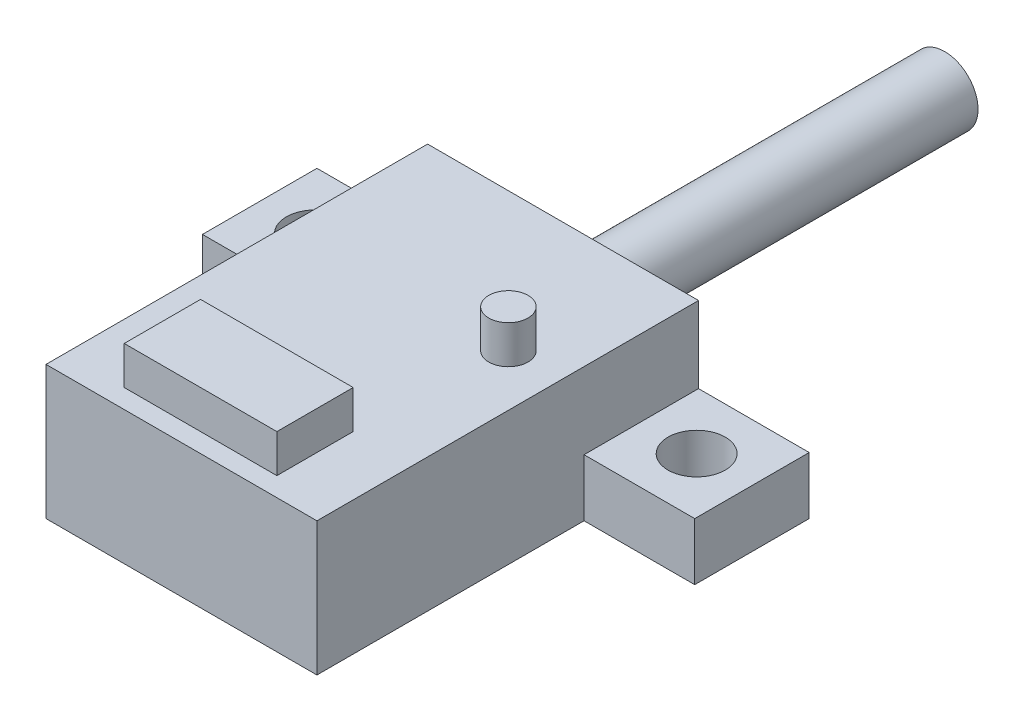
ISO-10303-21;
HEADER;
FILE_DESCRIPTION(('STEP AP214'),'2;1');
FILE_NAME('part.step','',(''),(''),'','','');
FILE_SCHEMA(('AUTOMOTIVE_DESIGN { 1 0 10303 214 1 1 1 1 }'));
ENDSEC;
DATA;
#1=APPLICATION_CONTEXT('core data for automotive mechanical design processes');
#2=APPLICATION_PROTOCOL_DEFINITION('international standard','automotive_design',2000,#1);
#3=PRODUCT_CONTEXT('',#1,'mechanical');
#4=PRODUCT('Part','Part','',(#3));
#5=PRODUCT_RELATED_PRODUCT_CATEGORY('part','',(#4));
#6=PRODUCT_DEFINITION_FORMATION('','',#4);
#7=PRODUCT_DEFINITION_CONTEXT('part definition',#1,'design');
#8=PRODUCT_DEFINITION('design','',#6,#7);
#9=PRODUCT_DEFINITION_SHAPE('','',#8);
#10=(LENGTH_UNIT() NAMED_UNIT(*) SI_UNIT(.MILLI.,.METRE.));
#11=(NAMED_UNIT(*) PLANE_ANGLE_UNIT() SI_UNIT($,.RADIAN.));
#12=(NAMED_UNIT(*) SI_UNIT($,.STERADIAN.) SOLID_ANGLE_UNIT());
#13=UNCERTAINTY_MEASURE_WITH_UNIT(LENGTH_MEASURE(1.E-05),#10,'distance_accuracy_value','');
#14=(GEOMETRIC_REPRESENTATION_CONTEXT(3) GLOBAL_UNCERTAINTY_ASSIGNED_CONTEXT((#13)) GLOBAL_UNIT_ASSIGNED_CONTEXT((#10,
#11,#12)) REPRESENTATION_CONTEXT('',''));
#15=CARTESIAN_POINT('',(0.,0.,0.));
#16=DIRECTION('',(0.,0.,1.));
#17=DIRECTION('',(1.,0.,0.));
#18=AXIS2_PLACEMENT_3D('',#15,#16,#17);
#19=CARTESIAN_POINT('',(0.,7.,0.));
#20=DIRECTION('',(0.,1.,0.));
#21=DIRECTION('',(0.,0.,1.));
#22=AXIS2_PLACEMENT_3D('',#19,#20,#21);
#23=PLANE('',#22);
#24=CARTESIAN_POINT('',(4.39839785551475,7.,-2.73609256270285));
#25=DIRECTION('',(0.,1.,0.));
#26=DIRECTION('',(0.,0.,1.));
#27=AXIS2_PLACEMENT_3D('',#24,#25,#26);
#28=CIRCLE('',#27,1.02876408886078);
#29=CARTESIAN_POINT('',(4.39839785551475,7.,-1.70732847384207));
#30=VERTEX_POINT('',#29);
#31=EDGE_CURVE('E334',#30,#30,#28,.T.);
#32=ORIENTED_EDGE('',*,*,#31,.F.);
#33=EDGE_LOOP('',(#32));
#34=FACE_BOUND('',#33,.T.);
#35=DIRECTION('',(0.,0.,1.));
#36=VECTOR('',#35,1.);
#37=CARTESIAN_POINT('',(7.1,7.,0.));
#38=LINE('',#37,#36);
#39=CARTESIAN_POINT('',(7.1,7.,-10.));
#40=VERTEX_POINT('',#39);
#41=CARTESIAN_POINT('',(7.10000000000001,7.,10.));
#42=VERTEX_POINT('',#41);
#43=EDGE_CURVE('E233',#40,#42,#38,.T.);
#44=ORIENTED_EDGE('',*,*,#43,.F.);
#45=DIRECTION('',(1.,0.,0.));
#46=VECTOR('',#45,1.);
#47=CARTESIAN_POINT('',(0.,7.,-10.));
#48=LINE('',#47,#46);
#49=CARTESIAN_POINT('',(-7.1,7.,-10.));
#50=VERTEX_POINT('',#49);
#51=EDGE_CURVE('E236',#50,#40,#48,.T.);
#52=ORIENTED_EDGE('',*,*,#51,.F.);
#53=DIRECTION('',(0.,0.,1.));
#54=VECTOR('',#53,1.);
#55=CARTESIAN_POINT('',(-7.1,7.,0.));
#56=LINE('',#55,#54);
#57=CARTESIAN_POINT('',(-7.09999999999999,7.,10.));
#58=VERTEX_POINT('',#57);
#59=EDGE_CURVE('E240',#50,#58,#56,.T.);
#60=ORIENTED_EDGE('',*,*,#59,.T.);
#61=DIRECTION('',(1.,0.,0.));
#62=VECTOR('',#61,1.);
#63=CARTESIAN_POINT('',(0.,7.,10.));
#64=LINE('',#63,#62);
#65=EDGE_CURVE('E242',#58,#42,#64,.T.);
#66=ORIENTED_EDGE('',*,*,#65,.T.);
#67=EDGE_LOOP('',(#44,#52,#60,#66));
#68=FACE_BOUND('',#67,.T.);
#69=DIRECTION('',(1.,0.,0.));
#70=VECTOR('',#69,1.);
#71=CARTESIAN_POINT('',(-4.,7.,9.));
#72=LINE('',#71,#70);
#73=CARTESIAN_POINT('',(-4.,7.,9.));
#74=VERTEX_POINT('',#73);
#75=CARTESIAN_POINT('',(4.,7.,9.));
#76=VERTEX_POINT('',#75);
#77=EDGE_CURVE('E346',#74,#76,#72,.T.);
#78=ORIENTED_EDGE('',*,*,#77,.F.);
#79=DIRECTION('',(0.,0.,1.));
#80=VECTOR('',#79,1.);
#81=CARTESIAN_POINT('',(-4.,7.,5.00000000000001));
#82=LINE('',#81,#80);
#83=CARTESIAN_POINT('',(-4.,7.,5.00000000000001));
#84=VERTEX_POINT('',#83);
#85=EDGE_CURVE('E166',#84,#74,#82,.T.);
#86=ORIENTED_EDGE('',*,*,#85,.F.);
#87=DIRECTION('',(-1.,0.,0.));
#88=VECTOR('',#87,1.);
#89=CARTESIAN_POINT('',(-4.,7.,5.00000000000001));
#90=LINE('',#89,#88);
#91=CARTESIAN_POINT('',(4.,7.,5.));
#92=VERTEX_POINT('',#91);
#93=EDGE_CURVE('E162',#92,#84,#90,.T.);
#94=ORIENTED_EDGE('',*,*,#93,.F.);
#95=DIRECTION('',(0.,0.,-1.));
#96=VECTOR('',#95,1.);
#97=CARTESIAN_POINT('',(4.,7.,5.));
#98=LINE('',#97,#96);
#99=EDGE_CURVE('E348',#76,#92,#98,.T.);
#100=ORIENTED_EDGE('',*,*,#99,.F.);
#101=EDGE_LOOP('',(#78,#86,#94,#100));
#102=FACE_BOUND('',#101,.T.);
#103=ADVANCED_FACE('F43',(#34,#68,#102),#23,.T.);
#104=CARTESIAN_POINT('',(7.1,7.,0.));
#105=DIRECTION('',(1.,0.,0.));
#106=DIRECTION('',(0.,0.,-1.));
#107=AXIS2_PLACEMENT_3D('',#104,#105,#106);
#108=PLANE('',#107);
#109=DIRECTION('',(0.,-1.,0.));
#110=VECTOR('',#109,1.);
#111=CARTESIAN_POINT('',(7.1,3.,-4.));
#112=LINE('',#111,#110);
#113=CARTESIAN_POINT('',(7.1,3.,-4.));
#114=VERTEX_POINT('',#113);
#115=CARTESIAN_POINT('',(7.1,0.,-4.));
#116=VERTEX_POINT('',#115);
#117=EDGE_CURVE('E198',#114,#116,#112,.T.);
#118=ORIENTED_EDGE('',*,*,#117,.F.);
#119=DIRECTION('',(0.,0.,1.));
#120=VECTOR('',#119,1.);
#121=CARTESIAN_POINT('',(7.1,3.,0.));
#122=LINE('',#121,#120);
#123=CARTESIAN_POINT('',(7.1,3.,-10.));
#124=VERTEX_POINT('',#123);
#125=EDGE_CURVE('E66',#124,#114,#122,.T.);
#126=ORIENTED_EDGE('',*,*,#125,.F.);
#127=DIRECTION('',(0.,-1.,0.));
#128=VECTOR('',#127,1.);
#129=CARTESIAN_POINT('',(7.1,7.,-10.));
#130=LINE('',#129,#128);
#131=EDGE_CURVE('E11',#40,#124,#130,.T.);
#132=ORIENTED_EDGE('',*,*,#131,.F.);
#133=ORIENTED_EDGE('',*,*,#43,.T.);
#134=DIRECTION('',(0.,-1.,0.));
#135=VECTOR('',#134,1.);
#136=CARTESIAN_POINT('',(7.10000000000001,7.,10.));
#137=LINE('',#136,#135);
#138=CARTESIAN_POINT('',(7.10000000000001,0.,10.));
#139=VERTEX_POINT('',#138);
#140=EDGE_CURVE('E244',#42,#139,#137,.T.);
#141=ORIENTED_EDGE('',*,*,#140,.T.);
#142=DIRECTION('',(0.,0.,1.));
#143=VECTOR('',#142,1.);
#144=CARTESIAN_POINT('',(7.1,0.,0.));
#145=LINE('',#144,#143);
#146=EDGE_CURVE('E232',#116,#139,#145,.T.);
#147=ORIENTED_EDGE('',*,*,#146,.F.);
#148=EDGE_LOOP('',(#118,#126,#132,#133,#141,#147));
#149=FACE_BOUND('',#148,.T.);
#150=ADVANCED_FACE('F45',(#149),#108,.T.);
#151=CARTESIAN_POINT('',(0.,7.,-10.));
#152=DIRECTION('',(0.,0.,-1.));
#153=DIRECTION('',(-1.,0.,0.));
#154=AXIS2_PLACEMENT_3D('',#151,#152,#153);
#155=PLANE('',#154);
#156=CARTESIAN_POINT('',(0.,2.99999999999295,-10.));
#157=DIRECTION('',(0.,0.,-1.));
#158=DIRECTION('',(-1.,0.,0.));
#159=AXIS2_PLACEMENT_3D('',#156,#157,#158);
#160=CIRCLE('',#159,1.75);
#161=CARTESIAN_POINT('',(-1.75,2.99999999999295,-10.));
#162=VERTEX_POINT('',#161);
#163=EDGE_CURVE('E329',#162,#162,#160,.T.);
#164=ORIENTED_EDGE('',*,*,#163,.F.);
#165=EDGE_LOOP('',(#164));
#166=FACE_BOUND('',#165,.T.);
#167=DIRECTION('',(1.,0.,0.));
#168=VECTOR('',#167,1.);
#169=CARTESIAN_POINT('',(0.,0.,-10.));
#170=LINE('',#169,#168);
#171=CARTESIAN_POINT('',(-12.9,0.,-10.));
#172=VERTEX_POINT('',#171);
#173=CARTESIAN_POINT('',(12.9,0.,-10.));
#174=VERTEX_POINT('',#173);
#175=EDGE_CURVE('E246',#172,#174,#170,.T.);
#176=ORIENTED_EDGE('',*,*,#175,.F.);
#177=DIRECTION('',(0.,-1.,0.));
#178=VECTOR('',#177,1.);
#179=CARTESIAN_POINT('',(-12.9,3.,-10.));
#180=LINE('',#179,#178);
#181=CARTESIAN_POINT('',(-12.9,3.,-10.));
#182=VERTEX_POINT('',#181);
#183=EDGE_CURVE('E229',#182,#172,#180,.T.);
#184=ORIENTED_EDGE('',*,*,#183,.F.);
#185=DIRECTION('',(-1.,0.,0.));
#186=VECTOR('',#185,1.);
#187=CARTESIAN_POINT('',(0.,3.,-10.));
#188=LINE('',#187,#186);
#189=CARTESIAN_POINT('',(-7.1,3.,-10.));
#190=VERTEX_POINT('',#189);
#191=EDGE_CURVE('E205',#190,#182,#188,.T.);
#192=ORIENTED_EDGE('',*,*,#191,.F.);
#193=DIRECTION('',(0.,-1.,0.));
#194=VECTOR('',#193,1.);
#195=CARTESIAN_POINT('',(-7.1,7.,-10.));
#196=LINE('',#195,#194);
#197=EDGE_CURVE('E51',#50,#190,#196,.T.);
#198=ORIENTED_EDGE('',*,*,#197,.F.);
#199=ORIENTED_EDGE('',*,*,#51,.T.);
#200=ORIENTED_EDGE('',*,*,#131,.T.);
#201=DIRECTION('',(1.,0.,0.));
#202=VECTOR('',#201,1.);
#203=CARTESIAN_POINT('',(0.,3.,-9.99999999999999));
#204=LINE('',#203,#202);
#205=CARTESIAN_POINT('',(12.9,3.,-10.));
#206=VERTEX_POINT('',#205);
#207=EDGE_CURVE('E176',#124,#206,#204,.T.);
#208=ORIENTED_EDGE('',*,*,#207,.T.);
#209=DIRECTION('',(0.,-1.,0.));
#210=VECTOR('',#209,1.);
#211=CARTESIAN_POINT('',(12.9,3.,-10.));
#212=LINE('',#211,#210);
#213=EDGE_CURVE('E188',#206,#174,#212,.T.);
#214=ORIENTED_EDGE('',*,*,#213,.T.);
#215=EDGE_LOOP('',(#176,#184,#192,#198,#199,#200,#208,#214));
#216=FACE_BOUND('',#215,.T.);
#217=ADVANCED_FACE('F264',(#166,#216),#155,.T.);
#218=CARTESIAN_POINT('',(-7.1,7.,0.));
#219=DIRECTION('',(1.,0.,0.));
#220=DIRECTION('',(0.,0.,-1.));
#221=AXIS2_PLACEMENT_3D('',#218,#219,#220);
#222=PLANE('',#221);
#223=ORIENTED_EDGE('',*,*,#197,.T.);
#224=DIRECTION('',(0.,0.,1.));
#225=VECTOR('',#224,1.);
#226=CARTESIAN_POINT('',(-7.1,3.,0.));
#227=LINE('',#226,#225);
#228=CARTESIAN_POINT('',(-7.1,3.,-4.));
#229=VERTEX_POINT('',#228);
#230=EDGE_CURVE('E214',#190,#229,#227,.T.);
#231=ORIENTED_EDGE('',*,*,#230,.T.);
#232=DIRECTION('',(0.,-1.,0.));
#233=VECTOR('',#232,1.);
#234=CARTESIAN_POINT('',(-7.1,3.,-4.));
#235=LINE('',#234,#233);
#236=CARTESIAN_POINT('',(-7.1,0.,-4.));
#237=VERTEX_POINT('',#236);
#238=EDGE_CURVE('E217',#229,#237,#235,.T.);
#239=ORIENTED_EDGE('',*,*,#238,.T.);
#240=DIRECTION('',(0.,0.,1.));
#241=VECTOR('',#240,1.);
#242=CARTESIAN_POINT('',(-7.1,0.,0.));
#243=LINE('',#242,#241);
#244=CARTESIAN_POINT('',(-7.09999999999999,0.,10.));
#245=VERTEX_POINT('',#244);
#246=EDGE_CURVE('E248',#237,#245,#243,.T.);
#247=ORIENTED_EDGE('',*,*,#246,.T.);
#248=DIRECTION('',(0.,-1.,0.));
#249=VECTOR('',#248,1.);
#250=CARTESIAN_POINT('',(-7.09999999999999,7.,10.));
#251=LINE('',#250,#249);
#252=EDGE_CURVE('E254',#58,#245,#251,.T.);
#253=ORIENTED_EDGE('',*,*,#252,.F.);
#254=ORIENTED_EDGE('',*,*,#59,.F.);
#255=EDGE_LOOP('',(#223,#231,#239,#247,#253,#254));
#256=FACE_BOUND('',#255,.T.);
#257=ADVANCED_FACE('F259',(#256),#222,.F.);
#258=CARTESIAN_POINT('',(0.,7.,10.));
#259=DIRECTION('',(0.,0.,-1.));
#260=DIRECTION('',(-1.,0.,0.));
#261=AXIS2_PLACEMENT_3D('',#258,#259,#260);
#262=PLANE('',#261);
#263=DIRECTION('',(1.,0.,0.));
#264=VECTOR('',#263,1.);
#265=CARTESIAN_POINT('',(0.,0.,10.));
#266=LINE('',#265,#264);
#267=EDGE_CURVE('E237',#245,#139,#266,.T.);
#268=ORIENTED_EDGE('',*,*,#267,.T.);
#269=ORIENTED_EDGE('',*,*,#140,.F.);
#270=ORIENTED_EDGE('',*,*,#65,.F.);
#271=ORIENTED_EDGE('',*,*,#252,.T.);
#272=EDGE_LOOP('',(#268,#269,#270,#271));
#273=FACE_BOUND('',#272,.T.);
#274=ADVANCED_FACE('F281',(#273),#262,.F.);
#275=CARTESIAN_POINT('',(0.,0.,0.));
#276=DIRECTION('',(0.,1.,0.));
#277=DIRECTION('',(0.,0.,1.));
#278=AXIS2_PLACEMENT_3D('',#275,#276,#277);
#279=PLANE('',#278);
#280=ORIENTED_EDGE('',*,*,#175,.T.);
#281=DIRECTION('',(0.,0.,1.));
#282=VECTOR('',#281,1.);
#283=CARTESIAN_POINT('',(12.9,0.,0.));
#284=LINE('',#283,#282);
#285=CARTESIAN_POINT('',(12.9,0.,-4.));
#286=VERTEX_POINT('',#285);
#287=EDGE_CURVE('E171',#174,#286,#284,.T.);
#288=ORIENTED_EDGE('',*,*,#287,.T.);
#289=DIRECTION('',(1.,0.,0.));
#290=VECTOR('',#289,1.);
#291=CARTESIAN_POINT('',(0.,0.,-4.));
#292=LINE('',#291,#290);
#293=EDGE_CURVE('E168',#116,#286,#292,.T.);
#294=ORIENTED_EDGE('',*,*,#293,.F.);
#295=ORIENTED_EDGE('',*,*,#146,.T.);
#296=ORIENTED_EDGE('',*,*,#267,.F.);
#297=ORIENTED_EDGE('',*,*,#246,.F.);
#298=DIRECTION('',(-1.,0.,0.));
#299=VECTOR('',#298,1.);
#300=CARTESIAN_POINT('',(0.,0.,-4.));
#301=LINE('',#300,#299);
#302=CARTESIAN_POINT('',(-12.9,0.,-4.));
#303=VERTEX_POINT('',#302);
#304=EDGE_CURVE('E206',#237,#303,#301,.T.);
#305=ORIENTED_EDGE('',*,*,#304,.T.);
#306=DIRECTION('',(0.,0.,1.));
#307=VECTOR('',#306,1.);
#308=CARTESIAN_POINT('',(-12.9,0.,0.));
#309=LINE('',#308,#307);
#310=EDGE_CURVE('E220',#172,#303,#309,.T.);
#311=ORIENTED_EDGE('',*,*,#310,.F.);
#312=EDGE_LOOP('',(#280,#288,#294,#295,#296,#297,#305,#311));
#313=FACE_BOUND('',#312,.T.);
#314=CARTESIAN_POINT('',(-10.,0.,-7.));
#315=DIRECTION('',(0.,1.,0.));
#316=DIRECTION('',(0.,0.,1.));
#317=AXIS2_PLACEMENT_3D('',#314,#315,#316);
#318=CIRCLE('',#317,1.5);
#319=CARTESIAN_POINT('',(-10.,0.,-5.5));
#320=VERTEX_POINT('',#319);
#321=EDGE_CURVE('E201',#320,#320,#318,.T.);
#322=ORIENTED_EDGE('',*,*,#321,.T.);
#323=EDGE_LOOP('',(#322));
#324=FACE_BOUND('',#323,.T.);
#325=CARTESIAN_POINT('',(10.,0.,-7.));
#326=DIRECTION('',(0.,1.,0.));
#327=DIRECTION('',(0.,0.,1.));
#328=AXIS2_PLACEMENT_3D('',#325,#326,#327);
#329=CIRCLE('',#328,1.5);
#330=CARTESIAN_POINT('',(10.,0.,-5.50000000000001));
#331=VERTEX_POINT('',#330);
#332=EDGE_CURVE('E179',#331,#331,#329,.F.);
#333=ORIENTED_EDGE('',*,*,#332,.F.);
#334=EDGE_LOOP('',(#333));
#335=FACE_BOUND('',#334,.T.);
#336=ADVANCED_FACE('F275',(#313,#324,#335),#279,.F.);
#337=CARTESIAN_POINT('',(-12.9,3.,0.));
#338=DIRECTION('',(1.,0.,0.));
#339=DIRECTION('',(0.,0.,-1.));
#340=AXIS2_PLACEMENT_3D('',#337,#338,#339);
#341=PLANE('',#340);
#342=ORIENTED_EDGE('',*,*,#310,.T.);
#343=DIRECTION('',(0.,-1.,0.));
#344=VECTOR('',#343,1.);
#345=CARTESIAN_POINT('',(-12.9,3.,-4.));
#346=LINE('',#345,#344);
#347=CARTESIAN_POINT('',(-12.9,3.,-4.));
#348=VERTEX_POINT('',#347);
#349=EDGE_CURVE('E227',#348,#303,#346,.T.);
#350=ORIENTED_EDGE('',*,*,#349,.F.);
#351=DIRECTION('',(0.,0.,1.));
#352=VECTOR('',#351,1.);
#353=CARTESIAN_POINT('',(-12.9,3.,0.));
#354=LINE('',#353,#352);
#355=EDGE_CURVE('E209',#182,#348,#354,.T.);
#356=ORIENTED_EDGE('',*,*,#355,.F.);
#357=ORIENTED_EDGE('',*,*,#183,.T.);
#358=EDGE_LOOP('',(#342,#350,#356,#357));
#359=FACE_BOUND('',#358,.T.);
#360=ADVANCED_FACE('F297',(#359),#341,.F.);
#361=CARTESIAN_POINT('',(0.,3.,-4.));
#362=DIRECTION('',(0.,0.,1.));
#363=DIRECTION('',(1.,0.,0.));
#364=AXIS2_PLACEMENT_3D('',#361,#362,#363);
#365=PLANE('',#364);
#366=ORIENTED_EDGE('',*,*,#304,.F.);
#367=ORIENTED_EDGE('',*,*,#238,.F.);
#368=DIRECTION('',(-1.,0.,0.));
#369=VECTOR('',#368,1.);
#370=CARTESIAN_POINT('',(0.,3.,-4.));
#371=LINE('',#370,#369);
#372=EDGE_CURVE('E211',#229,#348,#371,.T.);
#373=ORIENTED_EDGE('',*,*,#372,.T.);
#374=ORIENTED_EDGE('',*,*,#349,.T.);
#375=EDGE_LOOP('',(#366,#367,#373,#374));
#376=FACE_BOUND('',#375,.T.);
#377=ADVANCED_FACE('F271',(#376),#365,.T.);
#378=CARTESIAN_POINT('',(-10.,3.,-7.));
#379=DIRECTION('',(0.,-1.,0.));
#380=DIRECTION('',(0.,0.,-1.));
#381=AXIS2_PLACEMENT_3D('',#378,#379,#380);
#382=CYLINDRICAL_SURFACE('',#381,1.5);
#383=CARTESIAN_POINT('',(-10.,3.,-7.));
#384=DIRECTION('',(0.,1.,0.));
#385=DIRECTION('',(0.,0.,1.));
#386=AXIS2_PLACEMENT_3D('',#383,#384,#385);
#387=CIRCLE('',#386,1.5);
#388=CARTESIAN_POINT('',(-10.,3.,-5.5));
#389=VERTEX_POINT('',#388);
#390=EDGE_CURVE('E202',#389,#389,#387,.T.);
#391=ORIENTED_EDGE('',*,*,#390,.T.);
#392=EDGE_LOOP('',(#391));
#393=FACE_BOUND('',#392,.T.);
#394=ORIENTED_EDGE('',*,*,#321,.F.);
#395=EDGE_LOOP('',(#394));
#396=FACE_BOUND('',#395,.T.);
#397=ADVANCED_FACE('F304',(#393,#396),#382,.F.);
#398=CARTESIAN_POINT('',(0.,3.,0.));
#399=DIRECTION('',(0.,1.,0.));
#400=DIRECTION('',(0.,0.,1.));
#401=AXIS2_PLACEMENT_3D('',#398,#399,#400);
#402=PLANE('',#401);
#403=ORIENTED_EDGE('',*,*,#390,.F.);
#404=EDGE_LOOP('',(#403));
#405=FACE_BOUND('',#404,.T.);
#406=ORIENTED_EDGE('',*,*,#191,.T.);
#407=ORIENTED_EDGE('',*,*,#355,.T.);
#408=ORIENTED_EDGE('',*,*,#372,.F.);
#409=ORIENTED_EDGE('',*,*,#230,.F.);
#410=EDGE_LOOP('',(#406,#407,#408,#409));
#411=FACE_BOUND('',#410,.T.);
#412=ADVANCED_FACE('F268',(#405,#411),#402,.T.);
#413=CARTESIAN_POINT('',(0.,3.,-4.));
#414=DIRECTION('',(0.,0.,-1.));
#415=DIRECTION('',(-1.,0.,0.));
#416=AXIS2_PLACEMENT_3D('',#413,#414,#415);
#417=PLANE('',#416);
#418=ORIENTED_EDGE('',*,*,#293,.T.);
#419=DIRECTION('',(0.,-1.,0.));
#420=VECTOR('',#419,1.);
#421=CARTESIAN_POINT('',(12.9,3.,-4.));
#422=LINE('',#421,#420);
#423=CARTESIAN_POINT('',(12.9,3.,-4.));
#424=VERTEX_POINT('',#423);
#425=EDGE_CURVE('E196',#424,#286,#422,.T.);
#426=ORIENTED_EDGE('',*,*,#425,.F.);
#427=DIRECTION('',(1.,0.,0.));
#428=VECTOR('',#427,1.);
#429=CARTESIAN_POINT('',(0.,3.,-4.));
#430=LINE('',#429,#428);
#431=EDGE_CURVE('E181',#114,#424,#430,.T.);
#432=ORIENTED_EDGE('',*,*,#431,.F.);
#433=ORIENTED_EDGE('',*,*,#117,.T.);
#434=EDGE_LOOP('',(#418,#426,#432,#433));
#435=FACE_BOUND('',#434,.T.);
#436=ADVANCED_FACE('F378',(#435),#417,.F.);
#437=CARTESIAN_POINT('',(12.9,3.,0.));
#438=DIRECTION('',(1.,0.,0.));
#439=DIRECTION('',(0.,0.,-1.));
#440=AXIS2_PLACEMENT_3D('',#437,#438,#439);
#441=PLANE('',#440);
#442=ORIENTED_EDGE('',*,*,#287,.F.);
#443=ORIENTED_EDGE('',*,*,#213,.F.);
#444=DIRECTION('',(0.,0.,1.));
#445=VECTOR('',#444,1.);
#446=CARTESIAN_POINT('',(12.9,3.,0.));
#447=LINE('',#446,#445);
#448=EDGE_CURVE('E183',#206,#424,#447,.T.);
#449=ORIENTED_EDGE('',*,*,#448,.T.);
#450=ORIENTED_EDGE('',*,*,#425,.T.);
#451=EDGE_LOOP('',(#442,#443,#449,#450));
#452=FACE_BOUND('',#451,.T.);
#453=ADVANCED_FACE('F295',(#452),#441,.T.);
#454=CARTESIAN_POINT('',(10.,3.,-7.));
#455=DIRECTION('',(0.,-1.,0.));
#456=DIRECTION('',(0.,0.,-1.));
#457=AXIS2_PLACEMENT_3D('',#454,#455,#456);
#458=CYLINDRICAL_SURFACE('',#457,1.5);
#459=CARTESIAN_POINT('',(10.,3.,-7.));
#460=DIRECTION('',(0.,1.,0.));
#461=DIRECTION('',(0.,0.,1.));
#462=AXIS2_PLACEMENT_3D('',#459,#460,#461);
#463=CIRCLE('',#462,1.5);
#464=CARTESIAN_POINT('',(10.,3.,-5.50000000000001));
#465=VERTEX_POINT('',#464);
#466=EDGE_CURVE('E186',#465,#465,#463,.F.);
#467=ORIENTED_EDGE('',*,*,#466,.F.);
#468=EDGE_LOOP('',(#467));
#469=FACE_BOUND('',#468,.T.);
#470=ORIENTED_EDGE('',*,*,#332,.T.);
#471=EDGE_LOOP('',(#470));
#472=FACE_BOUND('',#471,.T.);
#473=ADVANCED_FACE('F372',(#469,#472),#458,.F.);
#474=CARTESIAN_POINT('',(0.,3.,0.));
#475=DIRECTION('',(0.,1.,0.));
#476=DIRECTION('',(0.,0.,1.));
#477=AXIS2_PLACEMENT_3D('',#474,#475,#476);
#478=PLANE('',#477);
#479=ORIENTED_EDGE('',*,*,#207,.F.);
#480=ORIENTED_EDGE('',*,*,#125,.T.);
#481=ORIENTED_EDGE('',*,*,#431,.T.);
#482=ORIENTED_EDGE('',*,*,#448,.F.);
#483=EDGE_LOOP('',(#479,#480,#481,#482));
#484=FACE_BOUND('',#483,.T.);
#485=ORIENTED_EDGE('',*,*,#466,.T.);
#486=EDGE_LOOP('',(#485));
#487=FACE_BOUND('',#486,.T.);
#488=ADVANCED_FACE('F289',(#484,#487),#478,.T.);
#489=CARTESIAN_POINT('',(-4.,9.,5.00000000000001));
#490=DIRECTION('',(1.,0.,0.));
#491=DIRECTION('',(0.,0.,-1.));
#492=AXIS2_PLACEMENT_3D('',#489,#490,#491);
#493=PLANE('',#492);
#494=ORIENTED_EDGE('',*,*,#85,.T.);
#495=DIRECTION('',(0.,-1.,0.));
#496=VECTOR('',#495,1.);
#497=CARTESIAN_POINT('',(-4.,9.,9.));
#498=LINE('',#497,#496);
#499=CARTESIAN_POINT('',(-4.,9.,9.));
#500=VERTEX_POINT('',#499);
#501=EDGE_CURVE('E147',#500,#74,#498,.T.);
#502=ORIENTED_EDGE('',*,*,#501,.F.);
#503=DIRECTION('',(0.,0.,1.));
#504=VECTOR('',#503,1.);
#505=CARTESIAN_POINT('',(-4.,9.,5.00000000000001));
#506=LINE('',#505,#504);
#507=CARTESIAN_POINT('',(-4.,9.,5.00000000000001));
#508=VERTEX_POINT('',#507);
#509=EDGE_CURVE('E154',#508,#500,#506,.T.);
#510=ORIENTED_EDGE('',*,*,#509,.F.);
#511=DIRECTION('',(0.,-1.,0.));
#512=VECTOR('',#511,1.);
#513=CARTESIAN_POINT('',(-4.,9.,5.00000000000001));
#514=LINE('',#513,#512);
#515=EDGE_CURVE('E344',#508,#84,#514,.T.);
#516=ORIENTED_EDGE('',*,*,#515,.T.);
#517=EDGE_LOOP('',(#494,#502,#510,#516));
#518=FACE_BOUND('',#517,.T.);
#519=ADVANCED_FACE('F164',(#518),#493,.F.);
#520=CARTESIAN_POINT('',(-4.,9.,9.));
#521=DIRECTION('',(0.,0.,-1.));
#522=DIRECTION('',(-1.,0.,0.));
#523=AXIS2_PLACEMENT_3D('',#520,#521,#522);
#524=PLANE('',#523);
#525=ORIENTED_EDGE('',*,*,#77,.T.);
#526=DIRECTION('',(0.,-1.,0.));
#527=VECTOR('',#526,1.);
#528=CARTESIAN_POINT('',(4.,9.,9.));
#529=LINE('',#528,#527);
#530=CARTESIAN_POINT('',(4.,9.,9.));
#531=VERTEX_POINT('',#530);
#532=EDGE_CURVE('E150',#531,#76,#529,.T.);
#533=ORIENTED_EDGE('',*,*,#532,.F.);
#534=DIRECTION('',(1.,0.,0.));
#535=VECTOR('',#534,1.);
#536=CARTESIAN_POINT('',(-4.,9.,9.));
#537=LINE('',#536,#535);
#538=EDGE_CURVE('E143',#500,#531,#537,.T.);
#539=ORIENTED_EDGE('',*,*,#538,.F.);
#540=ORIENTED_EDGE('',*,*,#501,.T.);
#541=EDGE_LOOP('',(#525,#533,#539,#540));
#542=FACE_BOUND('',#541,.T.);
#543=ADVANCED_FACE('F145',(#542),#524,.F.);
#544=CARTESIAN_POINT('',(4.,9.,5.));
#545=DIRECTION('',(-1.,0.,0.));
#546=DIRECTION('',(0.,0.,1.));
#547=AXIS2_PLACEMENT_3D('',#544,#545,#546);
#548=PLANE('',#547);
#549=ORIENTED_EDGE('',*,*,#99,.T.);
#550=DIRECTION('',(0.,-1.,0.));
#551=VECTOR('',#550,1.);
#552=CARTESIAN_POINT('',(4.,9.,5.));
#553=LINE('',#552,#551);
#554=CARTESIAN_POINT('',(4.,9.,5.));
#555=VERTEX_POINT('',#554);
#556=EDGE_CURVE('E58',#555,#92,#553,.T.);
#557=ORIENTED_EDGE('',*,*,#556,.F.);
#558=DIRECTION('',(0.,0.,-1.));
#559=VECTOR('',#558,1.);
#560=CARTESIAN_POINT('',(4.,9.,5.));
#561=LINE('',#560,#559);
#562=EDGE_CURVE('E153',#531,#555,#561,.T.);
#563=ORIENTED_EDGE('',*,*,#562,.F.);
#564=ORIENTED_EDGE('',*,*,#532,.T.);
#565=EDGE_LOOP('',(#549,#557,#563,#564));
#566=FACE_BOUND('',#565,.T.);
#567=ADVANCED_FACE('F354',(#566),#548,.F.);
#568=CARTESIAN_POINT('',(-4.,9.,5.00000000000001));
#569=DIRECTION('',(0.,0.,1.));
#570=DIRECTION('',(1.,0.,0.));
#571=AXIS2_PLACEMENT_3D('',#568,#569,#570);
#572=PLANE('',#571);
#573=ORIENTED_EDGE('',*,*,#93,.T.);
#574=ORIENTED_EDGE('',*,*,#515,.F.);
#575=DIRECTION('',(-1.,0.,0.));
#576=VECTOR('',#575,1.);
#577=CARTESIAN_POINT('',(-4.,9.,5.00000000000001));
#578=LINE('',#577,#576);
#579=EDGE_CURVE('E158',#555,#508,#578,.T.);
#580=ORIENTED_EDGE('',*,*,#579,.F.);
#581=ORIENTED_EDGE('',*,*,#556,.T.);
#582=EDGE_LOOP('',(#573,#574,#580,#581));
#583=FACE_BOUND('',#582,.T.);
#584=ADVANCED_FACE('F355',(#583),#572,.F.);
#585=CARTESIAN_POINT('',(0.,9.,0.));
#586=DIRECTION('',(0.,1.,0.));
#587=DIRECTION('',(0.,0.,1.));
#588=AXIS2_PLACEMENT_3D('',#585,#586,#587);
#589=PLANE('',#588);
#590=ORIENTED_EDGE('',*,*,#509,.T.);
#591=ORIENTED_EDGE('',*,*,#538,.T.);
#592=ORIENTED_EDGE('',*,*,#562,.T.);
#593=ORIENTED_EDGE('',*,*,#579,.T.);
#594=EDGE_LOOP('',(#590,#591,#592,#593));
#595=FACE_BOUND('',#594,.T.);
#596=ADVANCED_FACE('F157',(#595),#589,.T.);
#597=CARTESIAN_POINT('',(4.39839785551475,9.,-2.73609256270285));
#598=DIRECTION('',(0.,-1.,0.));
#599=DIRECTION('',(0.,0.,-1.));
#600=AXIS2_PLACEMENT_3D('',#597,#598,#599);
#601=CYLINDRICAL_SURFACE('',#600,1.02876408886078);
#602=CARTESIAN_POINT('',(4.39839785551475,9.,-2.73609256270285));
#603=DIRECTION('',(0.,1.,0.));
#604=DIRECTION('',(0.,0.,1.));
#605=AXIS2_PLACEMENT_3D('',#602,#603,#604);
#606=CIRCLE('',#605,1.02876408886078);
#607=CARTESIAN_POINT('',(4.39839785551475,9.,-1.70732847384207));
#608=VERTEX_POINT('',#607);
#609=EDGE_CURVE('E337',#608,#608,#606,.T.);
#610=ORIENTED_EDGE('',*,*,#609,.F.);
#611=EDGE_LOOP('',(#610));
#612=FACE_BOUND('',#611,.T.);
#613=ORIENTED_EDGE('',*,*,#31,.T.);
#614=EDGE_LOOP('',(#613));
#615=FACE_BOUND('',#614,.T.);
#616=ADVANCED_FACE('F361',(#612,#615),#601,.T.);
#617=CARTESIAN_POINT('',(4.39839785551475,9.,-2.73609256270285));
#618=DIRECTION('',(0.,1.,0.));
#619=DIRECTION('',(0.,0.,1.));
#620=AXIS2_PLACEMENT_3D('',#617,#618,#619);
#621=PLANE('',#620);
#622=ORIENTED_EDGE('',*,*,#609,.T.);
#623=EDGE_LOOP('',(#622));
#624=FACE_BOUND('',#623,.T.);
#625=ADVANCED_FACE('F512',(#624),#621,.T.);
#626=CARTESIAN_POINT('',(0.,2.99999999999295,-30.));
#627=DIRECTION('',(0.,0.,1.));
#628=DIRECTION('',(1.,0.,0.));
#629=AXIS2_PLACEMENT_3D('',#626,#627,#628);
#630=CYLINDRICAL_SURFACE('',#629,1.75);
#631=CARTESIAN_POINT('',(0.,2.99999999999295,-30.));
#632=DIRECTION('',(0.,0.,-1.));
#633=DIRECTION('',(-1.,0.,0.));
#634=AXIS2_PLACEMENT_3D('',#631,#632,#633);
#635=CIRCLE('',#634,1.75);
#636=CARTESIAN_POINT('',(-1.75,2.99999999999295,-30.));
#637=VERTEX_POINT('',#636);
#638=EDGE_CURVE('E331',#637,#637,#635,.T.);
#639=ORIENTED_EDGE('',*,*,#638,.F.);
#640=EDGE_LOOP('',(#639));
#641=FACE_BOUND('',#640,.T.);
#642=ORIENTED_EDGE('',*,*,#163,.T.);
#643=EDGE_LOOP('',(#642));
#644=FACE_BOUND('',#643,.T.);
#645=ADVANCED_FACE('F519',(#641,#644),#630,.T.);
#646=CARTESIAN_POINT('',(0.,2.99999999999295,-30.));
#647=DIRECTION('',(0.,0.,-1.));
#648=DIRECTION('',(-1.,0.,0.));
#649=AXIS2_PLACEMENT_3D('',#646,#647,#648);
#650=PLANE('',#649);
#651=ORIENTED_EDGE('',*,*,#638,.T.);
#652=EDGE_LOOP('',(#651));
#653=FACE_BOUND('',#652,.T.);
#654=ADVANCED_FACE('F527',(#653),#650,.T.);
#655=CLOSED_SHELL('',(#103,#150,#217,#257,#274,#336,#360,#377,#397,#412,#436,#453,#473,#488,
#519,#543,#567,#584,#596,#616,#625,#645,#654));
#656=MANIFOLD_SOLID_BREP('B2',#655);
#657=ADVANCED_BREP_SHAPE_REPRESENTATION('',(#18,#656),#14);
#658=SHAPE_DEFINITION_REPRESENTATION(#9,#657);
ENDSEC;
END-ISO-10303-21;
